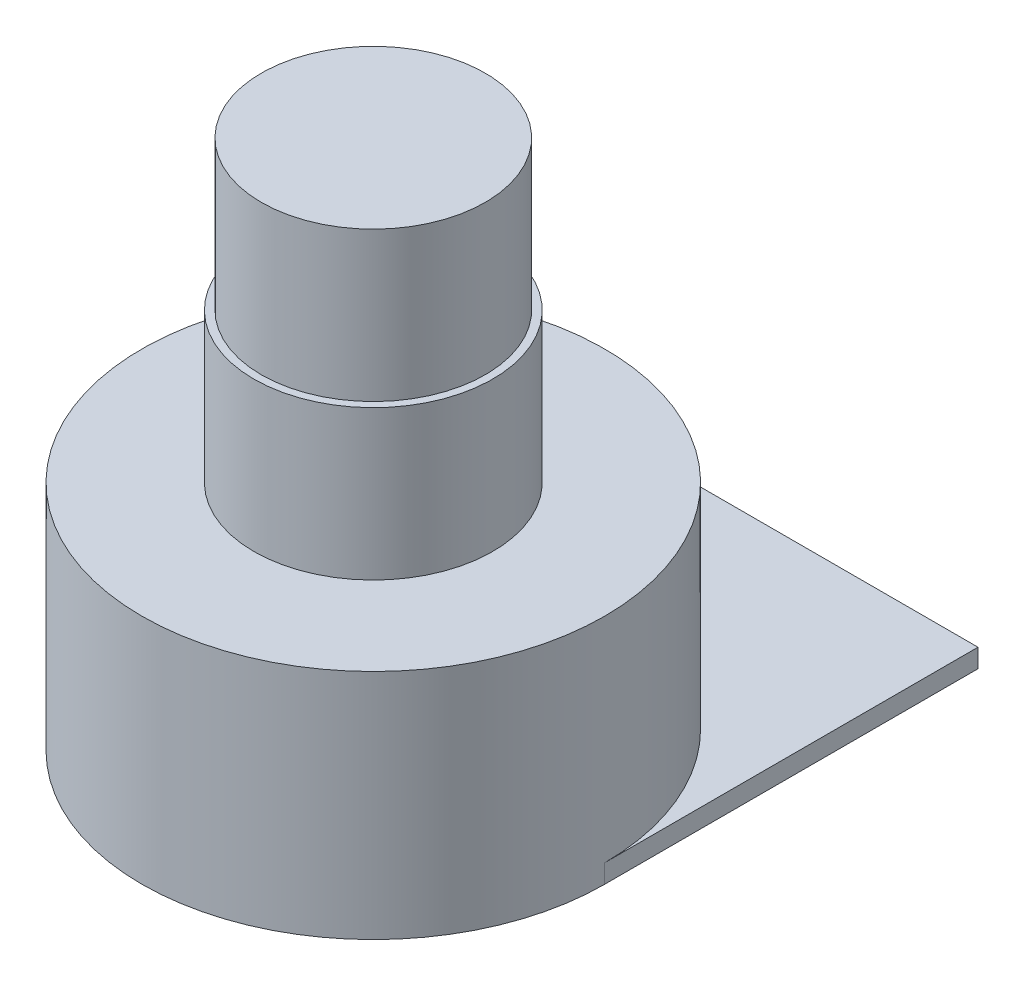
ISO-10303-21;
HEADER;
FILE_DESCRIPTION(('STEP AP214'),'2;1');
FILE_NAME('part.step','',(''),(''),'','','');
FILE_SCHEMA(('AUTOMOTIVE_DESIGN { 1 0 10303 214 1 1 1 1 }'));
ENDSEC;
DATA;
#1=APPLICATION_CONTEXT('core data for automotive mechanical design processes');
#2=APPLICATION_PROTOCOL_DEFINITION('international standard','automotive_design',2000,#1);
#3=PRODUCT_CONTEXT('',#1,'mechanical');
#4=PRODUCT('Part','Part','',(#3));
#5=PRODUCT_RELATED_PRODUCT_CATEGORY('part','',(#4));
#6=PRODUCT_DEFINITION_FORMATION('','',#4);
#7=PRODUCT_DEFINITION_CONTEXT('part definition',#1,'design');
#8=PRODUCT_DEFINITION('design','',#6,#7);
#9=PRODUCT_DEFINITION_SHAPE('','',#8);
#10=(LENGTH_UNIT() NAMED_UNIT(*) SI_UNIT(.MILLI.,.METRE.));
#11=(NAMED_UNIT(*) PLANE_ANGLE_UNIT() SI_UNIT($,.RADIAN.));
#12=(NAMED_UNIT(*) SI_UNIT($,.STERADIAN.) SOLID_ANGLE_UNIT());
#13=UNCERTAINTY_MEASURE_WITH_UNIT(LENGTH_MEASURE(1.E-05),#10,'distance_accuracy_value','');
#14=(GEOMETRIC_REPRESENTATION_CONTEXT(3) GLOBAL_UNCERTAINTY_ASSIGNED_CONTEXT((#13)) GLOBAL_UNIT_ASSIGNED_CONTEXT((#10,
#11,#12)) REPRESENTATION_CONTEXT('',''));
#15=CARTESIAN_POINT('',(0.,0.,0.));
#16=DIRECTION('',(0.,0.,1.));
#17=DIRECTION('',(1.,0.,0.));
#18=AXIS2_PLACEMENT_3D('',#15,#16,#17);
#19=CARTESIAN_POINT('',(0.,10.22,0.));
#20=DIRECTION('',(0.,1.,0.));
#21=DIRECTION('',(0.,0.,1.));
#22=AXIS2_PLACEMENT_3D('',#19,#20,#21);
#23=PLANE('',#22);
#24=CARTESIAN_POINT('',(0.,10.22,0.));
#25=DIRECTION('',(0.,1.,0.));
#26=DIRECTION('',(0.,0.,1.));
#27=AXIS2_PLACEMENT_3D('',#24,#25,#26);
#28=CIRCLE('',#27,3.2);
#29=CARTESIAN_POINT('',(0.,10.22,3.2));
#30=VERTEX_POINT('',#29);
#31=EDGE_CURVE('E98',#30,#30,#28,.T.);
#32=ORIENTED_EDGE('',*,*,#31,.T.);
#33=EDGE_LOOP('',(#32));
#34=FACE_BOUND('',#33,.T.);
#35=CARTESIAN_POINT('',(0.,10.22,0.));
#36=DIRECTION('',(0.,1.,0.));
#37=DIRECTION('',(0.,0.,1.));
#38=AXIS2_PLACEMENT_3D('',#35,#36,#37);
#39=CIRCLE('',#38,3.);
#40=CARTESIAN_POINT('',(0.,10.22,3.));
#41=VERTEX_POINT('',#40);
#42=EDGE_CURVE('E154',#41,#41,#39,.T.);
#43=ORIENTED_EDGE('',*,*,#42,.F.);
#44=EDGE_LOOP('',(#43));
#45=FACE_BOUND('',#44,.T.);
#46=ADVANCED_FACE('F31',(#34,#45),#23,.T.);
#47=CARTESIAN_POINT('',(0.,6.22,0.));
#48=DIRECTION('',(0.,1.,0.));
#49=DIRECTION('',(0.,0.,1.));
#50=AXIS2_PLACEMENT_3D('',#47,#48,#49);
#51=PLANE('',#50);
#52=CARTESIAN_POINT('',(0.,6.22,0.));
#53=DIRECTION('',(0.,1.,0.));
#54=DIRECTION('',(0.,0.,1.));
#55=AXIS2_PLACEMENT_3D('',#52,#53,#54);
#56=CIRCLE('',#55,6.2);
#57=CARTESIAN_POINT('',(0.,6.22,6.2));
#58=VERTEX_POINT('',#57);
#59=EDGE_CURVE('E39',#58,#58,#56,.T.);
#60=ORIENTED_EDGE('',*,*,#59,.T.);
#61=EDGE_LOOP('',(#60));
#62=FACE_BOUND('',#61,.T.);
#63=CARTESIAN_POINT('',(0.,6.22,0.));
#64=DIRECTION('',(0.,1.,0.));
#65=DIRECTION('',(0.,0.,1.));
#66=AXIS2_PLACEMENT_3D('',#63,#64,#65);
#67=CIRCLE('',#66,3.2);
#68=CARTESIAN_POINT('',(0.,6.22,3.2));
#69=VERTEX_POINT('',#68);
#70=EDGE_CURVE('E149',#69,#69,#67,.T.);
#71=ORIENTED_EDGE('',*,*,#70,.F.);
#72=EDGE_LOOP('',(#71));
#73=FACE_BOUND('',#72,.T.);
#74=ADVANCED_FACE('F123',(#62,#73),#51,.T.);
#75=CARTESIAN_POINT('',(0.,6.22,0.));
#76=DIRECTION('',(0.,-1.,0.));
#77=DIRECTION('',(0.,0.,-1.));
#78=AXIS2_PLACEMENT_3D('',#75,#76,#77);
#79=CYLINDRICAL_SURFACE('',#78,6.2);
#80=DIRECTION('',(0.,1.,0.));
#81=VECTOR('',#80,1.);
#82=CARTESIAN_POINT('',(6.2,0.,0.));
#83=LINE('',#82,#81);
#84=CARTESIAN_POINT('',(6.2,0.,0.));
#85=VERTEX_POINT('',#84);
#86=CARTESIAN_POINT('',(6.2,0.5,0.));
#87=VERTEX_POINT('',#86);
#88=EDGE_CURVE('E92',#85,#87,#83,.T.);
#89=ORIENTED_EDGE('',*,*,#88,.T.);
#90=CARTESIAN_POINT('',(0.,0.5,0.));
#91=DIRECTION('',(0.,-1.,0.));
#92=DIRECTION('',(0.,0.,-1.));
#93=AXIS2_PLACEMENT_3D('',#90,#91,#92);
#94=CIRCLE('',#93,6.2);
#95=CARTESIAN_POINT('',(-6.2,0.5,0.));
#96=VERTEX_POINT('',#95);
#97=EDGE_CURVE('E11',#96,#87,#94,.T.);
#98=ORIENTED_EDGE('',*,*,#97,.F.);
#99=DIRECTION('',(0.,1.,0.));
#100=VECTOR('',#99,1.);
#101=CARTESIAN_POINT('',(-6.2,0.,0.));
#102=LINE('',#101,#100);
#103=CARTESIAN_POINT('',(-6.2,0.,0.));
#104=VERTEX_POINT('',#103);
#105=EDGE_CURVE('E49',#104,#96,#102,.T.);
#106=ORIENTED_EDGE('',*,*,#105,.F.);
#107=CARTESIAN_POINT('',(0.,0.,0.));
#108=DIRECTION('',(0.,1.,0.));
#109=DIRECTION('',(0.,0.,1.));
#110=AXIS2_PLACEMENT_3D('',#107,#108,#109);
#111=CIRCLE('',#110,6.2);
#112=EDGE_CURVE('E75',#104,#85,#111,.T.);
#113=ORIENTED_EDGE('',*,*,#112,.T.);
#114=EDGE_LOOP('',(#89,#98,#106,#113));
#115=FACE_BOUND('',#114,.T.);
#116=ORIENTED_EDGE('',*,*,#59,.F.);
#117=EDGE_LOOP('',(#116));
#118=FACE_BOUND('',#117,.T.);
#119=ADVANCED_FACE('F33',(#115,#118),#79,.T.);
#120=CARTESIAN_POINT('',(0.,0.,0.));
#121=DIRECTION('',(0.,1.,0.));
#122=DIRECTION('',(0.,0.,1.));
#123=AXIS2_PLACEMENT_3D('',#120,#121,#122);
#124=PLANE('',#123);
#125=ORIENTED_EDGE('',*,*,#112,.F.);
#126=DIRECTION('',(0.,0.,-1.));
#127=VECTOR('',#126,1.);
#128=CARTESIAN_POINT('',(-6.2,0.,0.));
#129=LINE('',#128,#127);
#130=CARTESIAN_POINT('',(-6.2,0.,-10.));
#131=VERTEX_POINT('',#130);
#132=EDGE_CURVE('E68',#104,#131,#129,.T.);
#133=ORIENTED_EDGE('',*,*,#132,.T.);
#134=DIRECTION('',(1.,0.,0.));
#135=VECTOR('',#134,1.);
#136=CARTESIAN_POINT('',(-6.2,0.,-10.));
#137=LINE('',#136,#135);
#138=CARTESIAN_POINT('',(6.2,0.,-10.));
#139=VERTEX_POINT('',#138);
#140=EDGE_CURVE('E73',#131,#139,#137,.T.);
#141=ORIENTED_EDGE('',*,*,#140,.T.);
#142=DIRECTION('',(0.,0.,1.));
#143=VECTOR('',#142,1.);
#144=CARTESIAN_POINT('',(6.2,0.,0.));
#145=LINE('',#144,#143);
#146=EDGE_CURVE('E90',#139,#85,#145,.T.);
#147=ORIENTED_EDGE('',*,*,#146,.T.);
#148=EDGE_LOOP('',(#125,#133,#141,#147));
#149=FACE_BOUND('',#148,.T.);
#150=ADVANCED_FACE('F70',(#149),#124,.F.);
#151=CARTESIAN_POINT('',(0.,0.5,0.));
#152=DIRECTION('',(0.,-1.,0.));
#153=DIRECTION('',(0.,0.,-1.));
#154=AXIS2_PLACEMENT_3D('',#151,#152,#153);
#155=PLANE('',#154);
#156=DIRECTION('',(0.,0.,-1.));
#157=VECTOR('',#156,1.);
#158=CARTESIAN_POINT('',(-6.2,0.5,0.));
#159=LINE('',#158,#157);
#160=CARTESIAN_POINT('',(-6.2,0.5,-10.));
#161=VERTEX_POINT('',#160);
#162=EDGE_CURVE('E82',#96,#161,#159,.T.);
#163=ORIENTED_EDGE('',*,*,#162,.F.);
#164=ORIENTED_EDGE('',*,*,#97,.T.);
#165=DIRECTION('',(0.,0.,1.));
#166=VECTOR('',#165,1.);
#167=CARTESIAN_POINT('',(6.2,0.5,0.));
#168=LINE('',#167,#166);
#169=CARTESIAN_POINT('',(6.2,0.5,-10.));
#170=VERTEX_POINT('',#169);
#171=EDGE_CURVE('E77',#170,#87,#168,.T.);
#172=ORIENTED_EDGE('',*,*,#171,.F.);
#173=DIRECTION('',(1.,0.,0.));
#174=VECTOR('',#173,1.);
#175=CARTESIAN_POINT('',(-6.2,0.5,-10.));
#176=LINE('',#175,#174);
#177=EDGE_CURVE('E97',#161,#170,#176,.T.);
#178=ORIENTED_EDGE('',*,*,#177,.F.);
#179=EDGE_LOOP('',(#163,#164,#172,#178));
#180=FACE_BOUND('',#179,.T.);
#181=ADVANCED_FACE('F112',(#180),#155,.F.);
#182=CARTESIAN_POINT('',(-6.2,0.,0.));
#183=DIRECTION('',(1.,0.,0.));
#184=DIRECTION('',(0.,0.,-1.));
#185=AXIS2_PLACEMENT_3D('',#182,#183,#184);
#186=PLANE('',#185);
#187=ORIENTED_EDGE('',*,*,#162,.T.);
#188=DIRECTION('',(0.,1.,0.));
#189=VECTOR('',#188,1.);
#190=CARTESIAN_POINT('',(-6.2,0.,-10.));
#191=LINE('',#190,#189);
#192=EDGE_CURVE('E80',#131,#161,#191,.T.);
#193=ORIENTED_EDGE('',*,*,#192,.F.);
#194=ORIENTED_EDGE('',*,*,#132,.F.);
#195=ORIENTED_EDGE('',*,*,#105,.T.);
#196=EDGE_LOOP('',(#187,#193,#194,#195));
#197=FACE_BOUND('',#196,.T.);
#198=ADVANCED_FACE('F81',(#197),#186,.F.);
#199=CARTESIAN_POINT('',(-6.2,0.,-10.));
#200=DIRECTION('',(0.,0.,1.));
#201=DIRECTION('',(1.,0.,0.));
#202=AXIS2_PLACEMENT_3D('',#199,#200,#201);
#203=PLANE('',#202);
#204=ORIENTED_EDGE('',*,*,#177,.T.);
#205=DIRECTION('',(0.,1.,0.));
#206=VECTOR('',#205,1.);
#207=CARTESIAN_POINT('',(6.2,0.,-10.));
#208=LINE('',#207,#206);
#209=EDGE_CURVE('E85',#139,#170,#208,.T.);
#210=ORIENTED_EDGE('',*,*,#209,.F.);
#211=ORIENTED_EDGE('',*,*,#140,.F.);
#212=ORIENTED_EDGE('',*,*,#192,.T.);
#213=EDGE_LOOP('',(#204,#210,#211,#212));
#214=FACE_BOUND('',#213,.T.);
#215=ADVANCED_FACE('F87',(#214),#203,.F.);
#216=CARTESIAN_POINT('',(6.2,0.,0.));
#217=DIRECTION('',(-1.,0.,0.));
#218=DIRECTION('',(0.,0.,1.));
#219=AXIS2_PLACEMENT_3D('',#216,#217,#218);
#220=PLANE('',#219);
#221=ORIENTED_EDGE('',*,*,#171,.T.);
#222=ORIENTED_EDGE('',*,*,#88,.F.);
#223=ORIENTED_EDGE('',*,*,#146,.F.);
#224=ORIENTED_EDGE('',*,*,#209,.T.);
#225=EDGE_LOOP('',(#221,#222,#223,#224));
#226=FACE_BOUND('',#225,.T.);
#227=ADVANCED_FACE('F109',(#226),#220,.F.);
#228=CARTESIAN_POINT('',(0.,10.22,0.));
#229=DIRECTION('',(0.,-1.,0.));
#230=DIRECTION('',(0.,0.,-1.));
#231=AXIS2_PLACEMENT_3D('',#228,#229,#230);
#232=CYLINDRICAL_SURFACE('',#231,3.2);
#233=ORIENTED_EDGE('',*,*,#31,.F.);
#234=EDGE_LOOP('',(#233));
#235=FACE_BOUND('',#234,.T.);
#236=ORIENTED_EDGE('',*,*,#70,.T.);
#237=EDGE_LOOP('',(#236));
#238=FACE_BOUND('',#237,.T.);
#239=ADVANCED_FACE('F136',(#235,#238),#232,.T.);
#240=CARTESIAN_POINT('',(0.,14.22,0.));
#241=DIRECTION('',(0.,-1.,0.));
#242=DIRECTION('',(0.,0.,-1.));
#243=AXIS2_PLACEMENT_3D('',#240,#241,#242);
#244=CYLINDRICAL_SURFACE('',#243,3.);
#245=CARTESIAN_POINT('',(0.,14.22,0.));
#246=DIRECTION('',(0.,1.,0.));
#247=DIRECTION('',(0.,0.,1.));
#248=AXIS2_PLACEMENT_3D('',#245,#246,#247);
#249=CIRCLE('',#248,3.);
#250=CARTESIAN_POINT('',(0.,14.22,3.));
#251=VERTEX_POINT('',#250);
#252=EDGE_CURVE('E151',#251,#251,#249,.T.);
#253=ORIENTED_EDGE('',*,*,#252,.F.);
#254=EDGE_LOOP('',(#253));
#255=FACE_BOUND('',#254,.T.);
#256=ORIENTED_EDGE('',*,*,#42,.T.);
#257=EDGE_LOOP('',(#256));
#258=FACE_BOUND('',#257,.T.);
#259=ADVANCED_FACE('F134',(#255,#258),#244,.T.);
#260=CARTESIAN_POINT('',(0.,14.22,0.));
#261=DIRECTION('',(0.,1.,0.));
#262=DIRECTION('',(0.,0.,1.));
#263=AXIS2_PLACEMENT_3D('',#260,#261,#262);
#264=PLANE('',#263);
#265=ORIENTED_EDGE('',*,*,#252,.T.);
#266=EDGE_LOOP('',(#265));
#267=FACE_BOUND('',#266,.T.);
#268=ADVANCED_FACE('F143',(#267),#264,.T.);
#269=CLOSED_SHELL('',(#46,#74,#119,#150,#181,#198,#215,#227,#239,#259,#268));
#270=MANIFOLD_SOLID_BREP('B2',#269);
#271=ADVANCED_BREP_SHAPE_REPRESENTATION('',(#18,#270),#14);
#272=SHAPE_DEFINITION_REPRESENTATION(#9,#271);
ENDSEC;
END-ISO-10303-21;
